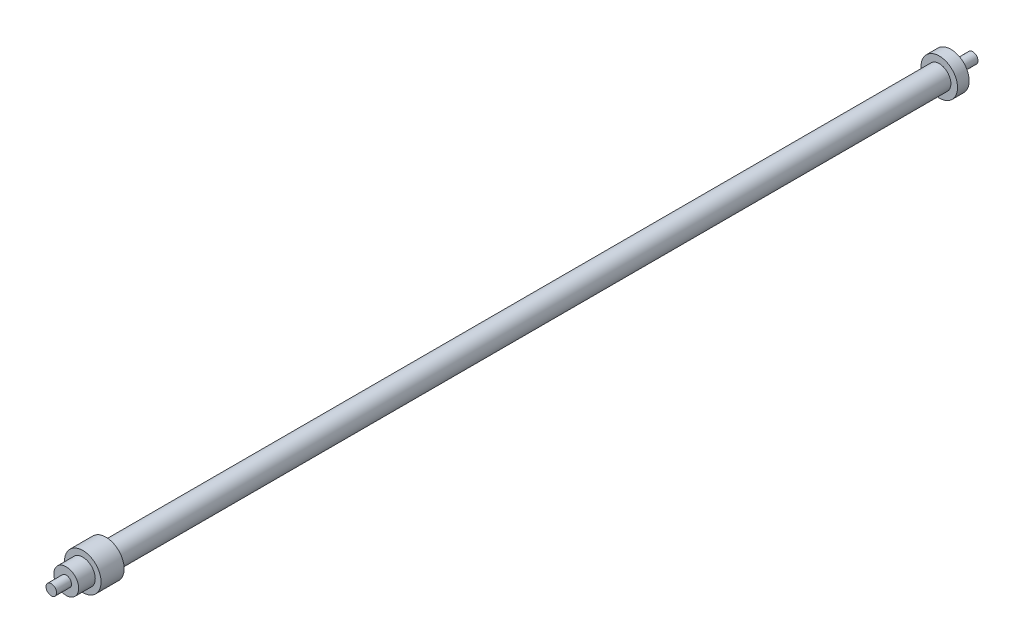
ISO-10303-21;
HEADER;
FILE_DESCRIPTION(('STEP AP214'),'2;1');
FILE_NAME('part.step','',(''),(''),'','','');
FILE_SCHEMA(('AUTOMOTIVE_DESIGN { 1 0 10303 214 1 1 1 1 }'));
ENDSEC;
DATA;
#1=APPLICATION_CONTEXT('core data for automotive mechanical design processes');
#2=APPLICATION_PROTOCOL_DEFINITION('international standard','automotive_design',2000,#1);
#3=PRODUCT_CONTEXT('',#1,'mechanical');
#4=PRODUCT('Part','Part','',(#3));
#5=PRODUCT_RELATED_PRODUCT_CATEGORY('part','',(#4));
#6=PRODUCT_DEFINITION_FORMATION('','',#4);
#7=PRODUCT_DEFINITION_CONTEXT('part definition',#1,'design');
#8=PRODUCT_DEFINITION('design','',#6,#7);
#9=PRODUCT_DEFINITION_SHAPE('','',#8);
#10=(LENGTH_UNIT() NAMED_UNIT(*) SI_UNIT(.MILLI.,.METRE.));
#11=(NAMED_UNIT(*) PLANE_ANGLE_UNIT() SI_UNIT($,.RADIAN.));
#12=(NAMED_UNIT(*) SI_UNIT($,.STERADIAN.) SOLID_ANGLE_UNIT());
#13=UNCERTAINTY_MEASURE_WITH_UNIT(LENGTH_MEASURE(1.E-05),#10,'distance_accuracy_value','');
#14=(GEOMETRIC_REPRESENTATION_CONTEXT(3) GLOBAL_UNCERTAINTY_ASSIGNED_CONTEXT((#13)) GLOBAL_UNIT_ASSIGNED_CONTEXT((#10,
#11,#12)) REPRESENTATION_CONTEXT('',''));
#15=CARTESIAN_POINT('',(0.,0.,0.));
#16=DIRECTION('',(0.,0.,1.));
#17=DIRECTION('',(1.,0.,0.));
#18=AXIS2_PLACEMENT_3D('',#15,#16,#17);
#19=CARTESIAN_POINT('',(0.,35.675,139.865098059221));
#20=DIRECTION('',(0.,0.,-1.));
#21=DIRECTION('',(-1.,0.,0.));
#22=AXIS2_PLACEMENT_3D('',#19,#20,#21);
#23=PLANE('',#22);
#24=CARTESIAN_POINT('',(0.,32.5,139.865098059221));
#25=DIRECTION('',(0.,0.,1.));
#26=DIRECTION('',(1.,0.,0.));
#27=AXIS2_PLACEMENT_3D('',#24,#25,#26);
#28=CIRCLE('',#27,3.175);
#29=CARTESIAN_POINT('',(3.175,32.5,139.865098059221));
#30=VERTEX_POINT('',#29);
#31=EDGE_CURVE('E77',#30,#30,#28,.T.);
#32=ORIENTED_EDGE('',*,*,#31,.T.);
#33=EDGE_LOOP('',(#32));
#34=FACE_BOUND('',#33,.T.);
#35=ADVANCED_FACE('F31',(#34),#23,.F.);
#36=CARTESIAN_POINT('',(0.,35.675,-415.134901940779));
#37=DIRECTION('',(0.,0.,1.));
#38=DIRECTION('',(1.,0.,0.));
#39=AXIS2_PLACEMENT_3D('',#36,#37,#38);
#40=PLANE('',#39);
#41=CARTESIAN_POINT('',(0.,32.5,-415.134901940779));
#42=DIRECTION('',(0.,0.,1.));
#43=DIRECTION('',(1.,0.,0.));
#44=AXIS2_PLACEMENT_3D('',#41,#42,#43);
#45=CIRCLE('',#44,3.175);
#46=CARTESIAN_POINT('',(3.175,32.5,-415.134901940779));
#47=VERTEX_POINT('',#46);
#48=EDGE_CURVE('E10',#47,#47,#45,.T.);
#49=ORIENTED_EDGE('',*,*,#48,.F.);
#50=EDGE_LOOP('',(#49));
#51=FACE_BOUND('',#50,.T.);
#52=ADVANCED_FACE('F155',(#51),#40,.F.);
#53=CARTESIAN_POINT('',(0.,32.5,139.865098059221));
#54=DIRECTION('',(0.,0.,1.));
#55=DIRECTION('',(1.,0.,0.));
#56=AXIS2_PLACEMENT_3D('',#53,#54,#55);
#57=CYLINDRICAL_SURFACE('',#56,3.175);
#58=CARTESIAN_POINT('',(0.,32.5,-405.034901940779));
#59=DIRECTION('',(0.,0.,1.));
#60=DIRECTION('',(1.,0.,0.));
#61=AXIS2_PLACEMENT_3D('',#58,#59,#60);
#62=CIRCLE('',#61,3.175);
#63=CARTESIAN_POINT('',(3.175,32.5,-405.034901940779));
#64=VERTEX_POINT('',#63);
#65=EDGE_CURVE('E37',#64,#64,#62,.T.);
#66=ORIENTED_EDGE('',*,*,#65,.F.);
#67=EDGE_LOOP('',(#66));
#68=FACE_BOUND('',#67,.T.);
#69=ORIENTED_EDGE('',*,*,#48,.T.);
#70=EDGE_LOOP('',(#69));
#71=FACE_BOUND('',#70,.T.);
#72=ADVANCED_FACE('F150',(#68,#71),#57,.T.);
#73=CARTESIAN_POINT('',(0.,36.5,-405.034901940779));
#74=DIRECTION('',(0.,0.,1.));
#75=DIRECTION('',(1.,0.,0.));
#76=AXIS2_PLACEMENT_3D('',#73,#74,#75);
#77=PLANE('',#76);
#78=CARTESIAN_POINT('',(0.,32.5,-405.034901940779));
#79=DIRECTION('',(0.,0.,1.));
#80=DIRECTION('',(1.,0.,0.));
#81=AXIS2_PLACEMENT_3D('',#78,#79,#80);
#82=CIRCLE('',#81,4.);
#83=CARTESIAN_POINT('',(4.,32.5,-405.034901940779));
#84=VERTEX_POINT('',#83);
#85=EDGE_CURVE('E41',#84,#84,#82,.T.);
#86=ORIENTED_EDGE('',*,*,#85,.F.);
#87=EDGE_LOOP('',(#86));
#88=FACE_BOUND('',#87,.T.);
#89=ORIENTED_EDGE('',*,*,#65,.T.);
#90=EDGE_LOOP('',(#89));
#91=FACE_BOUND('',#90,.T.);
#92=ADVANCED_FACE('F145',(#88,#91),#77,.F.);
#93=CARTESIAN_POINT('',(0.,32.5,139.865098059221));
#94=DIRECTION('',(0.,0.,1.));
#95=DIRECTION('',(1.,0.,0.));
#96=AXIS2_PLACEMENT_3D('',#93,#94,#95);
#97=CYLINDRICAL_SURFACE('',#96,4.);
#98=CARTESIAN_POINT('',(0.,32.5,-401.984901940779));
#99=DIRECTION('',(0.,0.,1.));
#100=DIRECTION('',(1.,0.,0.));
#101=AXIS2_PLACEMENT_3D('',#98,#99,#100);
#102=CIRCLE('',#101,4.);
#103=CARTESIAN_POINT('',(4.,32.5,-401.984901940779));
#104=VERTEX_POINT('',#103);
#105=EDGE_CURVE('E45',#104,#104,#102,.T.);
#106=ORIENTED_EDGE('',*,*,#105,.F.);
#107=EDGE_LOOP('',(#106));
#108=FACE_BOUND('',#107,.T.);
#109=ORIENTED_EDGE('',*,*,#85,.T.);
#110=EDGE_LOOP('',(#109));
#111=FACE_BOUND('',#110,.T.);
#112=ADVANCED_FACE('F139',(#108,#111),#97,.T.);
#113=CARTESIAN_POINT('',(0.,43.5000000000001,-401.984901940779));
#114=DIRECTION('',(0.,0.,1.));
#115=DIRECTION('',(1.,0.,0.));
#116=AXIS2_PLACEMENT_3D('',#113,#114,#115);
#117=PLANE('',#116);
#118=CARTESIAN_POINT('',(0.,32.5,-401.984901940779));
#119=DIRECTION('',(0.,0.,1.));
#120=DIRECTION('',(1.,0.,0.));
#121=AXIS2_PLACEMENT_3D('',#118,#119,#120);
#122=CIRCLE('',#121,11.0000000000001);
#123=CARTESIAN_POINT('',(11.0000000000001,32.5,-401.984901940779));
#124=VERTEX_POINT('',#123);
#125=EDGE_CURVE('E50',#124,#124,#122,.T.);
#126=ORIENTED_EDGE('',*,*,#125,.F.);
#127=EDGE_LOOP('',(#126));
#128=FACE_BOUND('',#127,.T.);
#129=ORIENTED_EDGE('',*,*,#105,.T.);
#130=EDGE_LOOP('',(#129));
#131=FACE_BOUND('',#130,.T.);
#132=ADVANCED_FACE('F133',(#128,#131),#117,.F.);
#133=CARTESIAN_POINT('',(0.,32.5,139.865098059221));
#134=DIRECTION('',(0.,0.,1.));
#135=DIRECTION('',(1.,0.,0.));
#136=AXIS2_PLACEMENT_3D('',#133,#134,#135);
#137=CYLINDRICAL_SURFACE('',#136,11.0000000000001);
#138=CARTESIAN_POINT('',(0.,32.5,-394.984901940779));
#139=DIRECTION('',(0.,0.,1.));
#140=DIRECTION('',(1.,0.,0.));
#141=AXIS2_PLACEMENT_3D('',#138,#139,#140);
#142=CIRCLE('',#141,11.0000000000001);
#143=CARTESIAN_POINT('',(11.0000000000001,32.5,-394.984901940779));
#144=VERTEX_POINT('',#143);
#145=EDGE_CURVE('E53',#144,#144,#142,.T.);
#146=ORIENTED_EDGE('',*,*,#145,.F.);
#147=EDGE_LOOP('',(#146));
#148=FACE_BOUND('',#147,.T.);
#149=ORIENTED_EDGE('',*,*,#125,.T.);
#150=EDGE_LOOP('',(#149));
#151=FACE_BOUND('',#150,.T.);
#152=ADVANCED_FACE('F127',(#148,#151),#137,.T.);
#153=CARTESIAN_POINT('',(0.,39.5,-394.984901940779));
#154=DIRECTION('',(0.,0.,-1.));
#155=DIRECTION('',(-1.,0.,0.));
#156=AXIS2_PLACEMENT_3D('',#153,#154,#155);
#157=PLANE('',#156);
#158=CARTESIAN_POINT('',(0.,32.5,-394.984901940779));
#159=DIRECTION('',(0.,0.,1.));
#160=DIRECTION('',(1.,0.,0.));
#161=AXIS2_PLACEMENT_3D('',#158,#159,#160);
#162=CIRCLE('',#161,7.00000000000003);
#163=CARTESIAN_POINT('',(7.00000000000003,32.5,-394.984901940779));
#164=VERTEX_POINT('',#163);
#165=EDGE_CURVE('E56',#164,#164,#162,.T.);
#166=ORIENTED_EDGE('',*,*,#165,.F.);
#167=EDGE_LOOP('',(#166));
#168=FACE_BOUND('',#167,.T.);
#169=ORIENTED_EDGE('',*,*,#145,.T.);
#170=EDGE_LOOP('',(#169));
#171=FACE_BOUND('',#170,.T.);
#172=ADVANCED_FACE('F121',(#168,#171),#157,.F.);
#173=CARTESIAN_POINT('',(0.,32.5,139.865098059221));
#174=DIRECTION('',(0.,0.,1.));
#175=DIRECTION('',(1.,0.,0.));
#176=AXIS2_PLACEMENT_3D('',#173,#174,#175);
#177=CYLINDRICAL_SURFACE('',#176,7.00000000000001);
#178=CARTESIAN_POINT('',(0.,32.5,106.955098059221));
#179=DIRECTION('',(0.,0.,1.));
#180=DIRECTION('',(1.,0.,0.));
#181=AXIS2_PLACEMENT_3D('',#178,#179,#180);
#182=CIRCLE('',#181,7.);
#183=CARTESIAN_POINT('',(7.,32.5,106.955098059221));
#184=VERTEX_POINT('',#183);
#185=EDGE_CURVE('E59',#184,#184,#182,.T.);
#186=ORIENTED_EDGE('',*,*,#185,.F.);
#187=EDGE_LOOP('',(#186));
#188=FACE_BOUND('',#187,.T.);
#189=ORIENTED_EDGE('',*,*,#165,.T.);
#190=EDGE_LOOP('',(#189));
#191=FACE_BOUND('',#190,.T.);
#192=ADVANCED_FACE('F115',(#188,#191),#177,.T.);
#193=CARTESIAN_POINT('',(0.,43.5,106.955098059221));
#194=DIRECTION('',(0.,0.,1.));
#195=DIRECTION('',(1.,0.,0.));
#196=AXIS2_PLACEMENT_3D('',#193,#194,#195);
#197=PLANE('',#196);
#198=CARTESIAN_POINT('',(0.,32.5,106.955098059221));
#199=DIRECTION('',(0.,0.,1.));
#200=DIRECTION('',(1.,0.,0.));
#201=AXIS2_PLACEMENT_3D('',#198,#199,#200);
#202=CIRCLE('',#201,11.);
#203=CARTESIAN_POINT('',(11.,32.5,106.955098059221));
#204=VERTEX_POINT('',#203);
#205=EDGE_CURVE('E62',#204,#204,#202,.T.);
#206=ORIENTED_EDGE('',*,*,#205,.F.);
#207=EDGE_LOOP('',(#206));
#208=FACE_BOUND('',#207,.T.);
#209=ORIENTED_EDGE('',*,*,#185,.T.);
#210=EDGE_LOOP('',(#209));
#211=FACE_BOUND('',#210,.T.);
#212=ADVANCED_FACE('F109',(#208,#211),#197,.F.);
#213=CARTESIAN_POINT('',(0.,32.5,139.865098059221));
#214=DIRECTION('',(0.,0.,1.));
#215=DIRECTION('',(1.,0.,0.));
#216=AXIS2_PLACEMENT_3D('',#213,#214,#215);
#217=CYLINDRICAL_SURFACE('',#216,11.);
#218=CARTESIAN_POINT('',(0.,32.5,120.865098059221));
#219=DIRECTION('',(0.,0.,1.));
#220=DIRECTION('',(1.,0.,0.));
#221=AXIS2_PLACEMENT_3D('',#218,#219,#220);
#222=CIRCLE('',#221,11.);
#223=CARTESIAN_POINT('',(11.,32.5,120.865098059221));
#224=VERTEX_POINT('',#223);
#225=EDGE_CURVE('E65',#224,#224,#222,.T.);
#226=ORIENTED_EDGE('',*,*,#225,.F.);
#227=EDGE_LOOP('',(#226));
#228=FACE_BOUND('',#227,.T.);
#229=ORIENTED_EDGE('',*,*,#205,.T.);
#230=EDGE_LOOP('',(#229));
#231=FACE_BOUND('',#230,.T.);
#232=ADVANCED_FACE('F103',(#228,#231),#217,.T.);
#233=CARTESIAN_POINT('',(0.,40.,120.865098059221));
#234=DIRECTION('',(0.,0.,-1.));
#235=DIRECTION('',(-1.,0.,0.));
#236=AXIS2_PLACEMENT_3D('',#233,#234,#235);
#237=PLANE('',#236);
#238=CARTESIAN_POINT('',(0.,32.5,120.865098059221));
#239=DIRECTION('',(0.,0.,1.));
#240=DIRECTION('',(1.,0.,0.));
#241=AXIS2_PLACEMENT_3D('',#238,#239,#240);
#242=CIRCLE('',#241,7.5);
#243=CARTESIAN_POINT('',(7.5,32.5,120.865098059221));
#244=VERTEX_POINT('',#243);
#245=EDGE_CURVE('E68',#244,#244,#242,.T.);
#246=ORIENTED_EDGE('',*,*,#245,.F.);
#247=EDGE_LOOP('',(#246));
#248=FACE_BOUND('',#247,.T.);
#249=ORIENTED_EDGE('',*,*,#225,.T.);
#250=EDGE_LOOP('',(#249));
#251=FACE_BOUND('',#250,.T.);
#252=ADVANCED_FACE('F97',(#248,#251),#237,.F.);
#253=CARTESIAN_POINT('',(0.,32.5,139.865098059221));
#254=DIRECTION('',(0.,0.,1.));
#255=DIRECTION('',(1.,0.,0.));
#256=AXIS2_PLACEMENT_3D('',#253,#254,#255);
#257=CYLINDRICAL_SURFACE('',#256,7.50000000000006);
#258=CARTESIAN_POINT('',(0.,32.5,130.865098059221));
#259=DIRECTION('',(0.,0.,1.));
#260=DIRECTION('',(1.,0.,0.));
#261=AXIS2_PLACEMENT_3D('',#258,#259,#260);
#262=CIRCLE('',#261,7.50000000000012);
#263=CARTESIAN_POINT('',(7.50000000000012,32.5,130.865098059221));
#264=VERTEX_POINT('',#263);
#265=EDGE_CURVE('E71',#264,#264,#262,.T.);
#266=ORIENTED_EDGE('',*,*,#265,.F.);
#267=EDGE_LOOP('',(#266));
#268=FACE_BOUND('',#267,.T.);
#269=ORIENTED_EDGE('',*,*,#245,.T.);
#270=EDGE_LOOP('',(#269));
#271=FACE_BOUND('',#270,.T.);
#272=ADVANCED_FACE('F91',(#268,#271),#257,.T.);
#273=CARTESIAN_POINT('',(0.,35.6750000000001,130.865098059221));
#274=DIRECTION('',(0.,0.,-1.));
#275=DIRECTION('',(-1.,0.,0.));
#276=AXIS2_PLACEMENT_3D('',#273,#274,#275);
#277=PLANE('',#276);
#278=CARTESIAN_POINT('',(0.,32.5,130.865098059221));
#279=DIRECTION('',(0.,0.,1.));
#280=DIRECTION('',(1.,0.,0.));
#281=AXIS2_PLACEMENT_3D('',#278,#279,#280);
#282=CIRCLE('',#281,3.17500000000012);
#283=CARTESIAN_POINT('',(3.17500000000012,32.5,130.865098059221));
#284=VERTEX_POINT('',#283);
#285=EDGE_CURVE('E74',#284,#284,#282,.T.);
#286=ORIENTED_EDGE('',*,*,#285,.F.);
#287=EDGE_LOOP('',(#286));
#288=FACE_BOUND('',#287,.T.);
#289=ORIENTED_EDGE('',*,*,#265,.T.);
#290=EDGE_LOOP('',(#289));
#291=FACE_BOUND('',#290,.T.);
#292=ADVANCED_FACE('F85',(#288,#291),#277,.F.);
#293=CARTESIAN_POINT('',(0.,32.5,139.865098059221));
#294=DIRECTION('',(0.,0.,1.));
#295=DIRECTION('',(1.,0.,0.));
#296=AXIS2_PLACEMENT_3D('',#293,#294,#295);
#297=CYLINDRICAL_SURFACE('',#296,3.17500000000006);
#298=ORIENTED_EDGE('',*,*,#31,.F.);
#299=EDGE_LOOP('',(#298));
#300=FACE_BOUND('',#299,.T.);
#301=ORIENTED_EDGE('',*,*,#285,.T.);
#302=EDGE_LOOP('',(#301));
#303=FACE_BOUND('',#302,.T.);
#304=ADVANCED_FACE('F82',(#300,#303),#297,.T.);
#305=CLOSED_SHELL('',(#35,#52,#72,#92,#112,#132,#152,#172,#192,#212,#232,#252,#272,#292,#304));
#306=MANIFOLD_SOLID_BREP('B2',#305);
#307=ADVANCED_BREP_SHAPE_REPRESENTATION('',(#18,#306),#14);
#308=SHAPE_DEFINITION_REPRESENTATION(#9,#307);
ENDSEC;
END-ISO-10303-21;
